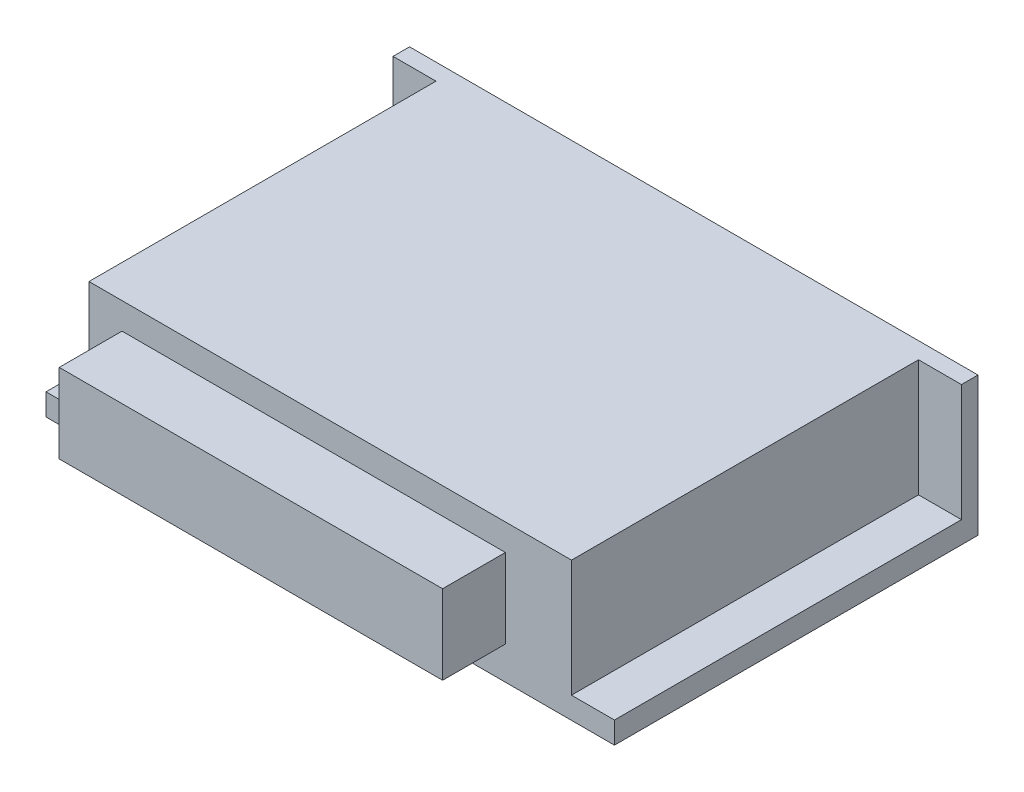
ISO-10303-21;
HEADER;
FILE_DESCRIPTION(('STEP AP214'),'2;1');
FILE_NAME('part.step','',(''),(''),'','','');
FILE_SCHEMA(('AUTOMOTIVE_DESIGN { 1 0 10303 214 1 1 1 1 }'));
ENDSEC;
DATA;
#1=APPLICATION_CONTEXT('core data for automotive mechanical design processes');
#2=APPLICATION_PROTOCOL_DEFINITION('international standard','automotive_design',2000,#1);
#3=PRODUCT_CONTEXT('',#1,'mechanical');
#4=PRODUCT('Part','Part','',(#3));
#5=PRODUCT_RELATED_PRODUCT_CATEGORY('part','',(#4));
#6=PRODUCT_DEFINITION_FORMATION('','',#4);
#7=PRODUCT_DEFINITION_CONTEXT('part definition',#1,'design');
#8=PRODUCT_DEFINITION('design','',#6,#7);
#9=PRODUCT_DEFINITION_SHAPE('','',#8);
#10=(LENGTH_UNIT() NAMED_UNIT(*) SI_UNIT(.MILLI.,.METRE.));
#11=(NAMED_UNIT(*) PLANE_ANGLE_UNIT() SI_UNIT($,.RADIAN.));
#12=(NAMED_UNIT(*) SI_UNIT($,.STERADIAN.) SOLID_ANGLE_UNIT());
#13=UNCERTAINTY_MEASURE_WITH_UNIT(LENGTH_MEASURE(1.E-05),#10,'distance_accuracy_value','');
#14=(GEOMETRIC_REPRESENTATION_CONTEXT(3) GLOBAL_UNCERTAINTY_ASSIGNED_CONTEXT((#13)) GLOBAL_UNIT_ASSIGNED_CONTEXT((#10,
#11,#12)) REPRESENTATION_CONTEXT('',''));
#15=CARTESIAN_POINT('',(0.,0.,0.));
#16=DIRECTION('',(0.,0.,1.));
#17=DIRECTION('',(1.,0.,0.));
#18=AXIS2_PLACEMENT_3D('',#15,#16,#17);
#19=CARTESIAN_POINT('',(-43.,3.3,27.5));
#20=DIRECTION('',(0.,0.,-1.));
#21=DIRECTION('',(-1.,0.,0.));
#22=AXIS2_PLACEMENT_3D('',#19,#20,#21);
#23=PLANE('',#22);
#24=DIRECTION('',(1.,0.,0.));
#25=VECTOR('',#24,1.);
#26=CARTESIAN_POINT('',(-43.,0.,27.5));
#27=LINE('',#26,#25);
#28=CARTESIAN_POINT('',(-43.,0.,27.5));
#29=VERTEX_POINT('',#28);
#30=CARTESIAN_POINT('',(43.,0.,27.5));
#31=VERTEX_POINT('',#30);
#32=EDGE_CURVE('E218',#29,#31,#27,.T.);
#33=ORIENTED_EDGE('',*,*,#32,.T.);
#34=DIRECTION('',(0.,-1.,0.));
#35=VECTOR('',#34,1.);
#36=CARTESIAN_POINT('',(43.,3.3,27.5));
#37=LINE('',#36,#35);
#38=CARTESIAN_POINT('',(43.,3.3,27.5));
#39=VERTEX_POINT('',#38);
#40=EDGE_CURVE('E223',#39,#31,#37,.T.);
#41=ORIENTED_EDGE('',*,*,#40,.F.);
#42=DIRECTION('',(1.,0.,0.));
#43=VECTOR('',#42,1.);
#44=CARTESIAN_POINT('',(-43.,3.3,27.5));
#45=LINE('',#44,#43);
#46=CARTESIAN_POINT('',(36.5,3.3,27.5));
#47=VERTEX_POINT('',#46);
#48=EDGE_CURVE('E220',#47,#39,#45,.T.);
#49=ORIENTED_EDGE('',*,*,#48,.F.);
#50=DIRECTION('',(0.,-1.,0.));
#51=VECTOR('',#50,1.);
#52=CARTESIAN_POINT('',(36.5,144.083299319722,27.5));
#53=LINE('',#52,#51);
#54=CARTESIAN_POINT('',(36.5,21.,27.5));
#55=VERTEX_POINT('',#54);
#56=EDGE_CURVE('E195',#55,#47,#53,.T.);
#57=ORIENTED_EDGE('',*,*,#56,.F.);
#58=DIRECTION('',(-1.,0.,0.));
#59=VECTOR('',#58,1.);
#60=CARTESIAN_POINT('',(0.,21.,27.5));
#61=LINE('',#60,#59);
#62=CARTESIAN_POINT('',(-36.5,21.,27.5));
#63=VERTEX_POINT('',#62);
#64=EDGE_CURVE('E169',#55,#63,#61,.T.);
#65=ORIENTED_EDGE('',*,*,#64,.T.);
#66=DIRECTION('',(0.,-1.,0.));
#67=VECTOR('',#66,1.);
#68=CARTESIAN_POINT('',(-36.5,144.083299319722,27.5));
#69=LINE('',#68,#67);
#70=CARTESIAN_POINT('',(-36.5,3.3,27.5));
#71=VERTEX_POINT('',#70);
#72=EDGE_CURVE('E198',#63,#71,#69,.T.);
#73=ORIENTED_EDGE('',*,*,#72,.T.);
#74=CARTESIAN_POINT('',(-43.,3.3,27.5));
#75=VERTEX_POINT('',#74);
#76=EDGE_CURVE('E221',#75,#71,#45,.T.);
#77=ORIENTED_EDGE('',*,*,#76,.F.);
#78=DIRECTION('',(0.,-1.,0.));
#79=VECTOR('',#78,1.);
#80=CARTESIAN_POINT('',(-43.,3.3,27.5));
#81=LINE('',#80,#79);
#82=EDGE_CURVE('E233',#75,#29,#81,.T.);
#83=ORIENTED_EDGE('',*,*,#82,.T.);
#84=EDGE_LOOP('',(#33,#41,#49,#57,#65,#73,#77,#83));
#85=FACE_BOUND('',#84,.T.);
#86=DIRECTION('',(0.,-1.,0.));
#87=VECTOR('',#86,1.);
#88=CARTESIAN_POINT('',(-31.5,5.,27.5));
#89=LINE('',#88,#87);
#90=CARTESIAN_POINT('',(-31.5,17.,27.5));
#91=VERTEX_POINT('',#90);
#92=CARTESIAN_POINT('',(-31.5,5.,27.5));
#93=VERTEX_POINT('',#92);
#94=EDGE_CURVE('E51',#91,#93,#89,.T.);
#95=ORIENTED_EDGE('',*,*,#94,.F.);
#96=DIRECTION('',(-1.,0.,0.));
#97=VECTOR('',#96,1.);
#98=CARTESIAN_POINT('',(-31.5,17.,27.5));
#99=LINE('',#98,#97);
#100=CARTESIAN_POINT('',(26.5,17.,27.5));
#101=VERTEX_POINT('',#100);
#102=EDGE_CURVE('E55',#101,#91,#99,.T.);
#103=ORIENTED_EDGE('',*,*,#102,.F.);
#104=DIRECTION('',(0.,1.,0.));
#105=VECTOR('',#104,1.);
#106=CARTESIAN_POINT('',(26.5,5.,27.5));
#107=LINE('',#106,#105);
#108=CARTESIAN_POINT('',(26.5,5.,27.5));
#109=VERTEX_POINT('',#108);
#110=EDGE_CURVE('E444',#109,#101,#107,.T.);
#111=ORIENTED_EDGE('',*,*,#110,.F.);
#112=DIRECTION('',(1.,0.,0.));
#113=VECTOR('',#112,1.);
#114=CARTESIAN_POINT('',(-31.5,5.,27.5));
#115=LINE('',#114,#113);
#116=EDGE_CURVE('E450',#93,#109,#115,.T.);
#117=ORIENTED_EDGE('',*,*,#116,.F.);
#118=EDGE_LOOP('',(#95,#103,#111,#117));
#119=FACE_BOUND('',#118,.T.);
#120=ADVANCED_FACE('F36',(#85,#119),#23,.F.);
#121=CARTESIAN_POINT('',(0.,3.3,0.));
#122=DIRECTION('',(0.,-1.,0.));
#123=DIRECTION('',(0.,0.,-1.));
#124=AXIS2_PLACEMENT_3D('',#121,#122,#123);
#125=PLANE('',#124);
#126=DIRECTION('',(0.,0.,1.));
#127=VECTOR('',#126,1.);
#128=CARTESIAN_POINT('',(-36.5,3.3,0.));
#129=LINE('',#128,#127);
#130=CARTESIAN_POINT('',(-36.5,3.3,-25.));
#131=VERTEX_POINT('',#130);
#132=EDGE_CURVE('E192',#131,#71,#129,.T.);
#133=ORIENTED_EDGE('',*,*,#132,.F.);
#134=DIRECTION('',(1.,0.,0.));
#135=VECTOR('',#134,1.);
#136=CARTESIAN_POINT('',(0.,3.3,-25.));
#137=LINE('',#136,#135);
#138=CARTESIAN_POINT('',(-43.,3.3,-25.));
#139=VERTEX_POINT('',#138);
#140=EDGE_CURVE('E189',#139,#131,#137,.T.);
#141=ORIENTED_EDGE('',*,*,#140,.F.);
#142=DIRECTION('',(0.,0.,1.));
#143=VECTOR('',#142,1.);
#144=CARTESIAN_POINT('',(-43.,3.3,27.5));
#145=LINE('',#144,#143);
#146=EDGE_CURVE('E217',#139,#75,#145,.T.);
#147=ORIENTED_EDGE('',*,*,#146,.T.);
#148=ORIENTED_EDGE('',*,*,#76,.T.);
#149=EDGE_LOOP('',(#133,#141,#147,#148));
#150=FACE_BOUND('',#149,.T.);
#151=ADVANCED_FACE('F270',(#150),#125,.F.);
#152=CARTESIAN_POINT('',(43.,3.3,27.5));
#153=DIRECTION('',(-1.,0.,0.));
#154=DIRECTION('',(0.,0.,1.));
#155=AXIS2_PLACEMENT_3D('',#152,#153,#154);
#156=PLANE('',#155);
#157=DIRECTION('',(0.,0.,-1.));
#158=VECTOR('',#157,1.);
#159=CARTESIAN_POINT('',(43.,0.,27.5));
#160=LINE('',#159,#158);
#161=CARTESIAN_POINT('',(43.,0.,-27.5));
#162=VERTEX_POINT('',#161);
#163=EDGE_CURVE('E185',#31,#162,#160,.T.);
#164=ORIENTED_EDGE('',*,*,#163,.T.);
#165=DIRECTION('',(0.,-1.,0.));
#166=VECTOR('',#165,1.);
#167=CARTESIAN_POINT('',(43.,3.3,-27.5));
#168=LINE('',#167,#166);
#169=CARTESIAN_POINT('',(43.,21.,-27.5));
#170=VERTEX_POINT('',#169);
#171=EDGE_CURVE('E12',#170,#162,#168,.T.);
#172=ORIENTED_EDGE('',*,*,#171,.F.);
#173=DIRECTION('',(0.,0.,1.));
#174=VECTOR('',#173,1.);
#175=CARTESIAN_POINT('',(43.,21.,0.));
#176=LINE('',#175,#174);
#177=CARTESIAN_POINT('',(43.,21.,-25.));
#178=VERTEX_POINT('',#177);
#179=EDGE_CURVE('E178',#170,#178,#176,.T.);
#180=ORIENTED_EDGE('',*,*,#179,.T.);
#181=DIRECTION('',(0.,-1.,0.));
#182=VECTOR('',#181,1.);
#183=CARTESIAN_POINT('',(43.,144.083299319722,-25.));
#184=LINE('',#183,#182);
#185=CARTESIAN_POINT('',(43.,3.3,-25.));
#186=VERTEX_POINT('',#185);
#187=EDGE_CURVE('E207',#178,#186,#184,.T.);
#188=ORIENTED_EDGE('',*,*,#187,.T.);
#189=DIRECTION('',(0.,0.,-1.));
#190=VECTOR('',#189,1.);
#191=CARTESIAN_POINT('',(43.,3.3,27.5));
#192=LINE('',#191,#190);
#193=EDGE_CURVE('E215',#39,#186,#192,.T.);
#194=ORIENTED_EDGE('',*,*,#193,.F.);
#195=ORIENTED_EDGE('',*,*,#40,.T.);
#196=EDGE_LOOP('',(#164,#172,#180,#188,#194,#195));
#197=FACE_BOUND('',#196,.T.);
#198=ADVANCED_FACE('F38',(#197),#156,.F.);
#199=CARTESIAN_POINT('',(-43.,3.3,-27.5));
#200=DIRECTION('',(0.,0.,1.));
#201=DIRECTION('',(1.,0.,0.));
#202=AXIS2_PLACEMENT_3D('',#199,#200,#201);
#203=PLANE('',#202);
#204=DIRECTION('',(-1.,0.,0.));
#205=VECTOR('',#204,1.);
#206=CARTESIAN_POINT('',(-43.,0.,-27.5));
#207=LINE('',#206,#205);
#208=CARTESIAN_POINT('',(-43.,0.,-27.5));
#209=VERTEX_POINT('',#208);
#210=EDGE_CURVE('E226',#162,#209,#207,.T.);
#211=ORIENTED_EDGE('',*,*,#210,.T.);
#212=DIRECTION('',(0.,-1.,0.));
#213=VECTOR('',#212,1.);
#214=CARTESIAN_POINT('',(-43.,3.3,-27.5));
#215=LINE('',#214,#213);
#216=CARTESIAN_POINT('',(-43.,21.,-27.5));
#217=VERTEX_POINT('',#216);
#218=EDGE_CURVE('E44',#217,#209,#215,.T.);
#219=ORIENTED_EDGE('',*,*,#218,.F.);
#220=DIRECTION('',(1.,0.,0.));
#221=VECTOR('',#220,1.);
#222=CARTESIAN_POINT('',(0.,21.,-27.5));
#223=LINE('',#222,#221);
#224=EDGE_CURVE('E175',#217,#170,#223,.T.);
#225=ORIENTED_EDGE('',*,*,#224,.T.);
#226=ORIENTED_EDGE('',*,*,#171,.T.);
#227=EDGE_LOOP('',(#211,#219,#225,#226));
#228=FACE_BOUND('',#227,.T.);
#229=ADVANCED_FACE('F274',(#228),#203,.F.);
#230=CARTESIAN_POINT('',(-43.,3.3,27.5));
#231=DIRECTION('',(1.,0.,0.));
#232=DIRECTION('',(0.,0.,-1.));
#233=AXIS2_PLACEMENT_3D('',#230,#231,#232);
#234=PLANE('',#233);
#235=DIRECTION('',(0.,0.,1.));
#236=VECTOR('',#235,1.);
#237=CARTESIAN_POINT('',(-43.,0.,27.5));
#238=LINE('',#237,#236);
#239=EDGE_CURVE('E228',#209,#29,#238,.T.);
#240=ORIENTED_EDGE('',*,*,#239,.T.);
#241=ORIENTED_EDGE('',*,*,#82,.F.);
#242=ORIENTED_EDGE('',*,*,#146,.F.);
#243=DIRECTION('',(0.,-1.,0.));
#244=VECTOR('',#243,1.);
#245=CARTESIAN_POINT('',(-43.,144.083299319722,-25.));
#246=LINE('',#245,#244);
#247=CARTESIAN_POINT('',(-43.,21.,-25.));
#248=VERTEX_POINT('',#247);
#249=EDGE_CURVE('E204',#248,#139,#246,.T.);
#250=ORIENTED_EDGE('',*,*,#249,.F.);
#251=DIRECTION('',(0.,0.,-1.));
#252=VECTOR('',#251,1.);
#253=CARTESIAN_POINT('',(-43.,21.,0.));
#254=LINE('',#253,#252);
#255=EDGE_CURVE('E172',#248,#217,#254,.T.);
#256=ORIENTED_EDGE('',*,*,#255,.T.);
#257=ORIENTED_EDGE('',*,*,#218,.T.);
#258=EDGE_LOOP('',(#240,#241,#242,#250,#256,#257));
#259=FACE_BOUND('',#258,.T.);
#260=ADVANCED_FACE('F238',(#259),#234,.F.);
#261=DIRECTION('',(1.,0.,0.));
#262=VECTOR('',#261,1.);
#263=CARTESIAN_POINT('',(0.,3.3,-25.));
#264=LINE('',#263,#262);
#265=CARTESIAN_POINT('',(36.5,3.3,-25.));
#266=VERTEX_POINT('',#265);
#267=EDGE_CURVE('E159',#266,#186,#264,.T.);
#268=ORIENTED_EDGE('',*,*,#267,.F.);
#269=DIRECTION('',(0.,0.,1.));
#270=VECTOR('',#269,1.);
#271=CARTESIAN_POINT('',(36.5,3.3,0.));
#272=LINE('',#271,#270);
#273=EDGE_CURVE('E157',#266,#47,#272,.T.);
#274=ORIENTED_EDGE('',*,*,#273,.T.);
#275=ORIENTED_EDGE('',*,*,#48,.T.);
#276=ORIENTED_EDGE('',*,*,#193,.T.);
#277=EDGE_LOOP('',(#268,#274,#275,#276));
#278=FACE_BOUND('',#277,.T.);
#279=ADVANCED_FACE('F255',(#278),#125,.F.);
#280=CARTESIAN_POINT('',(0.,0.,0.));
#281=DIRECTION('',(0.,-1.,0.));
#282=DIRECTION('',(0.,0.,-1.));
#283=AXIS2_PLACEMENT_3D('',#280,#281,#282);
#284=PLANE('',#283);
#285=ORIENTED_EDGE('',*,*,#163,.F.);
#286=ORIENTED_EDGE('',*,*,#32,.F.);
#287=ORIENTED_EDGE('',*,*,#239,.F.);
#288=ORIENTED_EDGE('',*,*,#210,.F.);
#289=EDGE_LOOP('',(#285,#286,#287,#288));
#290=FACE_BOUND('',#289,.T.);
#291=ADVANCED_FACE('F246',(#290),#284,.T.);
#292=CARTESIAN_POINT('',(-36.5,144.083299319722,0.));
#293=DIRECTION('',(1.,0.,0.));
#294=DIRECTION('',(0.,0.,-1.));
#295=AXIS2_PLACEMENT_3D('',#292,#293,#294);
#296=PLANE('',#295);
#297=ORIENTED_EDGE('',*,*,#72,.F.);
#298=DIRECTION('',(0.,0.,-1.));
#299=VECTOR('',#298,1.);
#300=CARTESIAN_POINT('',(-36.5,21.,0.));
#301=LINE('',#300,#299);
#302=CARTESIAN_POINT('',(-36.5,21.,-25.));
#303=VERTEX_POINT('',#302);
#304=EDGE_CURVE('E165',#63,#303,#301,.T.);
#305=ORIENTED_EDGE('',*,*,#304,.T.);
#306=DIRECTION('',(0.,-1.,0.));
#307=VECTOR('',#306,1.);
#308=CARTESIAN_POINT('',(-36.5,144.083299319722,-25.));
#309=LINE('',#308,#307);
#310=EDGE_CURVE('E201',#303,#131,#309,.T.);
#311=ORIENTED_EDGE('',*,*,#310,.T.);
#312=ORIENTED_EDGE('',*,*,#132,.T.);
#313=EDGE_LOOP('',(#297,#305,#311,#312));
#314=FACE_BOUND('',#313,.T.);
#315=ADVANCED_FACE('F267',(#314),#296,.F.);
#316=CARTESIAN_POINT('',(0.,144.083299319722,-25.));
#317=DIRECTION('',(0.,0.,-1.));
#318=DIRECTION('',(-1.,0.,0.));
#319=AXIS2_PLACEMENT_3D('',#316,#317,#318);
#320=PLANE('',#319);
#321=ORIENTED_EDGE('',*,*,#310,.F.);
#322=DIRECTION('',(-1.,0.,0.));
#323=VECTOR('',#322,1.);
#324=CARTESIAN_POINT('',(0.,21.,-25.));
#325=LINE('',#324,#323);
#326=EDGE_CURVE('E168',#303,#248,#325,.T.);
#327=ORIENTED_EDGE('',*,*,#326,.T.);
#328=ORIENTED_EDGE('',*,*,#249,.T.);
#329=ORIENTED_EDGE('',*,*,#140,.T.);
#330=EDGE_LOOP('',(#321,#327,#328,#329));
#331=FACE_BOUND('',#330,.T.);
#332=ADVANCED_FACE('F273',(#331),#320,.F.);
#333=CARTESIAN_POINT('',(0.,144.083299319722,-25.));
#334=DIRECTION('',(0.,0.,-1.));
#335=DIRECTION('',(-1.,0.,0.));
#336=AXIS2_PLACEMENT_3D('',#333,#334,#335);
#337=PLANE('',#336);
#338=ORIENTED_EDGE('',*,*,#187,.F.);
#339=DIRECTION('',(-1.,0.,0.));
#340=VECTOR('',#339,1.);
#341=CARTESIAN_POINT('',(0.,21.,-25.));
#342=LINE('',#341,#340);
#343=CARTESIAN_POINT('',(36.5,21.,-25.));
#344=VERTEX_POINT('',#343);
#345=EDGE_CURVE('E181',#178,#344,#342,.T.);
#346=ORIENTED_EDGE('',*,*,#345,.T.);
#347=DIRECTION('',(0.,-1.,0.));
#348=VECTOR('',#347,1.);
#349=CARTESIAN_POINT('',(36.5,144.083299319722,-25.));
#350=LINE('',#349,#348);
#351=EDGE_CURVE('E210',#344,#266,#350,.T.);
#352=ORIENTED_EDGE('',*,*,#351,.T.);
#353=ORIENTED_EDGE('',*,*,#267,.T.);
#354=EDGE_LOOP('',(#338,#346,#352,#353));
#355=FACE_BOUND('',#354,.T.);
#356=ADVANCED_FACE('F293',(#355),#337,.F.);
#357=CARTESIAN_POINT('',(36.5,144.083299319722,0.));
#358=DIRECTION('',(1.,0.,0.));
#359=DIRECTION('',(0.,0.,-1.));
#360=AXIS2_PLACEMENT_3D('',#357,#358,#359);
#361=PLANE('',#360);
#362=DIRECTION('',(0.,0.,-1.));
#363=VECTOR('',#362,1.);
#364=CARTESIAN_POINT('',(36.5,21.,0.));
#365=LINE('',#364,#363);
#366=EDGE_CURVE('E184',#55,#344,#365,.T.);
#367=ORIENTED_EDGE('',*,*,#366,.F.);
#368=ORIENTED_EDGE('',*,*,#56,.T.);
#369=ORIENTED_EDGE('',*,*,#273,.F.);
#370=ORIENTED_EDGE('',*,*,#351,.F.);
#371=EDGE_LOOP('',(#367,#368,#369,#370));
#372=FACE_BOUND('',#371,.T.);
#373=ADVANCED_FACE('F260',(#372),#361,.T.);
#374=CARTESIAN_POINT('',(0.,21.,0.));
#375=DIRECTION('',(0.,-1.,0.));
#376=DIRECTION('',(0.,0.,-1.));
#377=AXIS2_PLACEMENT_3D('',#374,#375,#376);
#378=PLANE('',#377);
#379=ORIENTED_EDGE('',*,*,#366,.T.);
#380=ORIENTED_EDGE('',*,*,#345,.F.);
#381=ORIENTED_EDGE('',*,*,#179,.F.);
#382=ORIENTED_EDGE('',*,*,#224,.F.);
#383=ORIENTED_EDGE('',*,*,#255,.F.);
#384=ORIENTED_EDGE('',*,*,#326,.F.);
#385=ORIENTED_EDGE('',*,*,#304,.F.);
#386=ORIENTED_EDGE('',*,*,#64,.F.);
#387=EDGE_LOOP('',(#379,#380,#381,#382,#383,#384,#385,#386));
#388=FACE_BOUND('',#387,.T.);
#389=ADVANCED_FACE('F263',(#388),#378,.F.);
#390=CARTESIAN_POINT('',(-31.5,5.,37.));
#391=DIRECTION('',(1.,0.,0.));
#392=DIRECTION('',(0.,0.,-1.));
#393=AXIS2_PLACEMENT_3D('',#390,#391,#392);
#394=PLANE('',#393);
#395=ORIENTED_EDGE('',*,*,#94,.T.);
#396=DIRECTION('',(0.,0.,-1.));
#397=VECTOR('',#396,1.);
#398=CARTESIAN_POINT('',(-31.5,5.,37.));
#399=LINE('',#398,#397);
#400=CARTESIAN_POINT('',(-31.5,5.,37.));
#401=VERTEX_POINT('',#400);
#402=EDGE_CURVE('E140',#401,#93,#399,.T.);
#403=ORIENTED_EDGE('',*,*,#402,.F.);
#404=DIRECTION('',(0.,-1.,0.));
#405=VECTOR('',#404,1.);
#406=CARTESIAN_POINT('',(-31.5,5.,37.));
#407=LINE('',#406,#405);
#408=CARTESIAN_POINT('',(-31.5,17.,37.));
#409=VERTEX_POINT('',#408);
#410=EDGE_CURVE('E146',#409,#401,#407,.T.);
#411=ORIENTED_EDGE('',*,*,#410,.F.);
#412=DIRECTION('',(0.,0.,-1.));
#413=VECTOR('',#412,1.);
#414=CARTESIAN_POINT('',(-31.5,17.,37.));
#415=LINE('',#414,#413);
#416=EDGE_CURVE('E442',#409,#91,#415,.T.);
#417=ORIENTED_EDGE('',*,*,#416,.T.);
#418=EDGE_LOOP('',(#395,#403,#411,#417));
#419=FACE_BOUND('',#418,.T.);
#420=ADVANCED_FACE('F156',(#419),#394,.F.);
#421=CARTESIAN_POINT('',(-31.5,5.,37.));
#422=DIRECTION('',(0.,1.,0.));
#423=DIRECTION('',(0.,0.,1.));
#424=AXIS2_PLACEMENT_3D('',#421,#422,#423);
#425=PLANE('',#424);
#426=ORIENTED_EDGE('',*,*,#116,.T.);
#427=DIRECTION('',(0.,0.,-1.));
#428=VECTOR('',#427,1.);
#429=CARTESIAN_POINT('',(26.5,5.,37.));
#430=LINE('',#429,#428);
#431=CARTESIAN_POINT('',(26.5,5.,37.));
#432=VERTEX_POINT('',#431);
#433=EDGE_CURVE('E142',#432,#109,#430,.T.);
#434=ORIENTED_EDGE('',*,*,#433,.F.);
#435=DIRECTION('',(1.,0.,0.));
#436=VECTOR('',#435,1.);
#437=CARTESIAN_POINT('',(-31.5,5.,37.));
#438=LINE('',#437,#436);
#439=EDGE_CURVE('E135',#401,#432,#438,.T.);
#440=ORIENTED_EDGE('',*,*,#439,.F.);
#441=ORIENTED_EDGE('',*,*,#402,.T.);
#442=EDGE_LOOP('',(#426,#434,#440,#441));
#443=FACE_BOUND('',#442,.T.);
#444=ADVANCED_FACE('F138',(#443),#425,.F.);
#445=CARTESIAN_POINT('',(26.5,5.,37.));
#446=DIRECTION('',(-1.,0.,0.));
#447=DIRECTION('',(0.,0.,1.));
#448=AXIS2_PLACEMENT_3D('',#445,#446,#447);
#449=PLANE('',#448);
#450=ORIENTED_EDGE('',*,*,#110,.T.);
#451=DIRECTION('',(0.,0.,-1.));
#452=VECTOR('',#451,1.);
#453=CARTESIAN_POINT('',(26.5,17.,37.));
#454=LINE('',#453,#452);
#455=CARTESIAN_POINT('',(26.5,17.,37.));
#456=VERTEX_POINT('',#455);
#457=EDGE_CURVE('E161',#456,#101,#454,.T.);
#458=ORIENTED_EDGE('',*,*,#457,.F.);
#459=DIRECTION('',(0.,1.,0.));
#460=VECTOR('',#459,1.);
#461=CARTESIAN_POINT('',(26.5,5.,37.));
#462=LINE('',#461,#460);
#463=EDGE_CURVE('E145',#432,#456,#462,.T.);
#464=ORIENTED_EDGE('',*,*,#463,.F.);
#465=ORIENTED_EDGE('',*,*,#433,.T.);
#466=EDGE_LOOP('',(#450,#458,#464,#465));
#467=FACE_BOUND('',#466,.T.);
#468=ADVANCED_FACE('F307',(#467),#449,.F.);
#469=CARTESIAN_POINT('',(-31.5,17.,37.));
#470=DIRECTION('',(0.,-1.,0.));
#471=DIRECTION('',(0.,0.,-1.));
#472=AXIS2_PLACEMENT_3D('',#469,#470,#471);
#473=PLANE('',#472);
#474=ORIENTED_EDGE('',*,*,#102,.T.);
#475=ORIENTED_EDGE('',*,*,#416,.F.);
#476=DIRECTION('',(-1.,0.,0.));
#477=VECTOR('',#476,1.);
#478=CARTESIAN_POINT('',(-31.5,17.,37.));
#479=LINE('',#478,#477);
#480=EDGE_CURVE('E151',#456,#409,#479,.T.);
#481=ORIENTED_EDGE('',*,*,#480,.F.);
#482=ORIENTED_EDGE('',*,*,#457,.T.);
#483=EDGE_LOOP('',(#474,#475,#481,#482));
#484=FACE_BOUND('',#483,.T.);
#485=ADVANCED_FACE('F310',(#484),#473,.F.);
#486=CARTESIAN_POINT('',(0.,0.,37.));
#487=DIRECTION('',(0.,0.,-1.));
#488=DIRECTION('',(-1.,0.,0.));
#489=AXIS2_PLACEMENT_3D('',#486,#487,#488);
#490=PLANE('',#489);
#491=ORIENTED_EDGE('',*,*,#410,.T.);
#492=ORIENTED_EDGE('',*,*,#439,.T.);
#493=ORIENTED_EDGE('',*,*,#463,.T.);
#494=ORIENTED_EDGE('',*,*,#480,.T.);
#495=EDGE_LOOP('',(#491,#492,#493,#494));
#496=FACE_BOUND('',#495,.T.);
#497=ADVANCED_FACE('F149',(#496),#490,.F.);
#498=CLOSED_SHELL('',(#120,#151,#198,#229,#260,#279,#291,#315,#332,#356,#373,#389,#420,#444,
#468,#485,#497));
#499=MANIFOLD_SOLID_BREP('B2',#498);
#500=ADVANCED_BREP_SHAPE_REPRESENTATION('',(#18,#499),#14);
#501=SHAPE_DEFINITION_REPRESENTATION(#9,#500);
ENDSEC;
END-ISO-10303-21;
